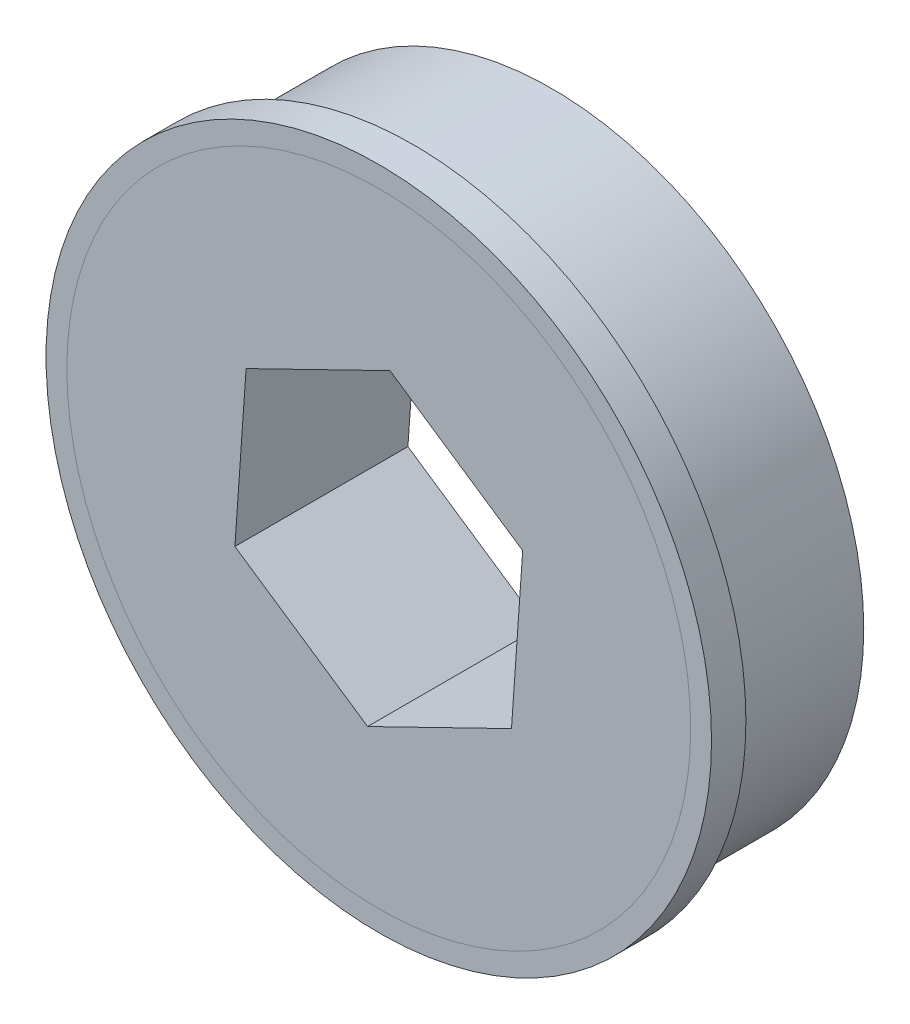
ISO-10303-21;
HEADER;
FILE_DESCRIPTION(('STEP AP214'),'2;1');
FILE_NAME('part.step','',(''),(''),'','','');
FILE_SCHEMA(('AUTOMOTIVE_DESIGN { 1 0 10303 214 1 1 1 1 }'));
ENDSEC;
DATA;
#1=APPLICATION_CONTEXT('core data for automotive mechanical design processes');
#2=APPLICATION_PROTOCOL_DEFINITION('international standard','automotive_design',2000,#1);
#3=PRODUCT_CONTEXT('',#1,'mechanical');
#4=PRODUCT('Part','Part','',(#3));
#5=PRODUCT_RELATED_PRODUCT_CATEGORY('part','',(#4));
#6=PRODUCT_DEFINITION_FORMATION('','',#4);
#7=PRODUCT_DEFINITION_CONTEXT('part definition',#1,'design');
#8=PRODUCT_DEFINITION('design','',#6,#7);
#9=PRODUCT_DEFINITION_SHAPE('','',#8);
#10=(LENGTH_UNIT() NAMED_UNIT(*) SI_UNIT(.MILLI.,.METRE.));
#11=(NAMED_UNIT(*) PLANE_ANGLE_UNIT() SI_UNIT($,.RADIAN.));
#12=(NAMED_UNIT(*) SI_UNIT($,.STERADIAN.) SOLID_ANGLE_UNIT());
#13=UNCERTAINTY_MEASURE_WITH_UNIT(LENGTH_MEASURE(1.E-05),#10,'distance_accuracy_value','');
#14=(GEOMETRIC_REPRESENTATION_CONTEXT(3) GLOBAL_UNCERTAINTY_ASSIGNED_CONTEXT((#13)) GLOBAL_UNIT_ASSIGNED_CONTEXT((#10,
#11,#12)) REPRESENTATION_CONTEXT('',''));
#15=CARTESIAN_POINT('',(0.,0.,0.));
#16=DIRECTION('',(0.,0.,1.));
#17=DIRECTION('',(1.,0.,0.));
#18=AXIS2_PLACEMENT_3D('',#15,#16,#17);
#19=CARTESIAN_POINT('',(0.,0.,6.35));
#20=DIRECTION('',(0.,0.,1.));
#21=DIRECTION('',(1.,0.,0.));
#22=AXIS2_PLACEMENT_3D('',#19,#20,#21);
#23=CYLINDRICAL_SURFACE('',#22,15.24);
#24=CARTESIAN_POINT('',(0.,0.,6.35));
#25=DIRECTION('',(0.,0.,1.));
#26=DIRECTION('',(1.,0.,0.));
#27=AXIS2_PLACEMENT_3D('',#24,#25,#26);
#28=CIRCLE('',#27,15.24);
#29=CARTESIAN_POINT('',(15.24,0.,6.35));
#30=VERTEX_POINT('',#29);
#31=EDGE_CURVE('E11',#30,#30,#28,.T.);
#32=ORIENTED_EDGE('',*,*,#31,.T.);
#33=EDGE_LOOP('',(#32));
#34=FACE_BOUND('',#33,.T.);
#35=CARTESIAN_POINT('',(0.,0.,7.9248));
#36=DIRECTION('',(0.,0.,1.));
#37=DIRECTION('',(1.,0.,0.));
#38=AXIS2_PLACEMENT_3D('',#35,#36,#37);
#39=CIRCLE('',#38,15.24);
#40=CARTESIAN_POINT('',(15.24,0.,7.9248));
#41=VERTEX_POINT('',#40);
#42=EDGE_CURVE('E44',#41,#41,#39,.T.);
#43=ORIENTED_EDGE('',*,*,#42,.F.);
#44=EDGE_LOOP('',(#43));
#45=FACE_BOUND('',#44,.T.);
#46=ADVANCED_FACE('F41',(#34,#45),#23,.T.);
#47=CARTESIAN_POINT('',(0.,0.,6.35));
#48=DIRECTION('',(0.,0.,1.));
#49=DIRECTION('',(1.,0.,0.));
#50=AXIS2_PLACEMENT_3D('',#47,#48,#49);
#51=PLANE('',#50);
#52=CARTESIAN_POINT('',(0.,0.,6.35));
#53=DIRECTION('',(0.,0.,1.));
#54=DIRECTION('',(1.,0.,0.));
#55=AXIS2_PLACEMENT_3D('',#52,#53,#54);
#56=CIRCLE('',#55,14.2875);
#57=CARTESIAN_POINT('',(14.2875,0.,6.35));
#58=VERTEX_POINT('',#57);
#59=EDGE_CURVE('E51',#58,#58,#56,.T.);
#60=ORIENTED_EDGE('',*,*,#59,.T.);
#61=EDGE_LOOP('',(#60));
#62=FACE_BOUND('',#61,.T.);
#63=ORIENTED_EDGE('',*,*,#31,.F.);
#64=EDGE_LOOP('',(#63));
#65=FACE_BOUND('',#64,.T.);
#66=ADVANCED_FACE('F59',(#62,#65),#51,.F.);
#67=CARTESIAN_POINT('',(0.,0.,7.9248));
#68=DIRECTION('',(0.,0.,1.));
#69=DIRECTION('',(1.,0.,0.));
#70=AXIS2_PLACEMENT_3D('',#67,#68,#69);
#71=PLANE('',#70);
#72=CARTESIAN_POINT('',(0.,0.,7.9248));
#73=DIRECTION('',(0.,0.,1.));
#74=DIRECTION('',(1.,0.,0.));
#75=AXIS2_PLACEMENT_3D('',#72,#73,#74);
#76=CIRCLE('',#75,14.2875);
#77=CARTESIAN_POINT('',(14.2875,0.,7.9248));
#78=VERTEX_POINT('',#77);
#79=EDGE_CURVE('E53',#78,#78,#76,.T.);
#80=ORIENTED_EDGE('',*,*,#79,.F.);
#81=EDGE_LOOP('',(#80));
#82=FACE_BOUND('',#81,.T.);
#83=ORIENTED_EDGE('',*,*,#42,.T.);
#84=EDGE_LOOP('',(#83));
#85=FACE_BOUND('',#84,.T.);
#86=ADVANCED_FACE('F65',(#82,#85),#71,.T.);
#87=CARTESIAN_POINT('',(0.,0.,6.35));
#88=DIRECTION('',(0.,0.,1.));
#89=DIRECTION('',(1.,0.,0.));
#90=AXIS2_PLACEMENT_3D('',#87,#88,#89);
#91=CYLINDRICAL_SURFACE('',#90,14.2875);
#92=ORIENTED_EDGE('',*,*,#59,.F.);
#93=EDGE_LOOP('',(#92));
#94=FACE_BOUND('',#93,.T.);
#95=ORIENTED_EDGE('',*,*,#79,.T.);
#96=EDGE_LOOP('',(#95));
#97=FACE_BOUND('',#96,.T.);
#98=ADVANCED_FACE('F62',(#94,#97),#91,.F.);
#99=CLOSED_SHELL('',(#46,#66,#86,#98));
#100=MANIFOLD_SOLID_BREP('B2',#99);
#101=CARTESIAN_POINT('',(0.,0.,7.9248));
#102=DIRECTION('',(0.,0.,-1.));
#103=DIRECTION('',(-1.,0.,0.));
#104=AXIS2_PLACEMENT_3D('',#101,#102,#103);
#105=CYLINDRICAL_SURFACE('',#104,14.2875);
#106=CARTESIAN_POINT('',(0.,0.,7.9248));
#107=DIRECTION('',(0.,0.,1.));
#108=DIRECTION('',(1.,0.,0.));
#109=AXIS2_PLACEMENT_3D('',#106,#107,#108);
#110=CIRCLE('',#109,14.2875);
#111=CARTESIAN_POINT('',(14.2875,0.,7.9248));
#112=VERTEX_POINT('',#111);
#113=EDGE_CURVE('E39',#112,#112,#110,.T.);
#114=ORIENTED_EDGE('',*,*,#113,.F.);
#115=EDGE_LOOP('',(#114));
#116=FACE_BOUND('',#115,.T.);
#117=CARTESIAN_POINT('',(0.,0.,0.));
#118=DIRECTION('',(0.,0.,1.));
#119=DIRECTION('',(1.,0.,0.));
#120=AXIS2_PLACEMENT_3D('',#117,#118,#119);
#121=CIRCLE('',#120,14.2875);
#122=CARTESIAN_POINT('',(14.2875,0.,0.));
#123=VERTEX_POINT('',#122);
#124=EDGE_CURVE('E106',#123,#123,#121,.T.);
#125=ORIENTED_EDGE('',*,*,#124,.T.);
#126=EDGE_LOOP('',(#125));
#127=FACE_BOUND('',#126,.T.);
#128=ADVANCED_FACE('F103',(#116,#127),#105,.T.);
#129=CARTESIAN_POINT('',(0.,0.,7.9248));
#130=DIRECTION('',(0.,0.,1.));
#131=DIRECTION('',(1.,0.,0.));
#132=AXIS2_PLACEMENT_3D('',#129,#130,#131);
#133=PLANE('',#132);
#134=DIRECTION('',(0.069947406769218,0.997550680560272,0.));
#135=VECTOR('',#134,1.);
#136=CARTESIAN_POINT('',(6.07800744284922,-4.10136061057826,7.9248));
#137=LINE('',#136,#135);
#138=CARTESIAN_POINT('',(6.07800744284922,-4.10136061057826,7.9248));
#139=VERTEX_POINT('',#138);
#140=CARTESIAN_POINT('',(6.59088620026623,3.21302854460919,7.9248));
#141=VERTEX_POINT('',#140);
#142=EDGE_CURVE('E117',#139,#141,#137,.T.);
#143=ORIENTED_EDGE('',*,*,#142,.F.);
#144=DIRECTION('',(0.89887793431226,0.438199109089149,0.));
#145=VECTOR('',#144,1.);
#146=CARTESIAN_POINT('',(-0.512878757417019,-7.31438915518744,7.9248));
#147=LINE('',#146,#145);
#148=CARTESIAN_POINT('',(-0.512878757417019,-7.31438915518744,7.9248));
#149=VERTEX_POINT('',#148);
#150=EDGE_CURVE('E174',#149,#139,#147,.T.);
#151=ORIENTED_EDGE('',*,*,#150,.F.);
#152=DIRECTION('',(0.828930527543042,-0.559351571471123,0.));
#153=VECTOR('',#152,1.);
#154=CARTESIAN_POINT('',(-6.59088620026623,-3.21302854460918,7.9248));
#155=LINE('',#154,#153);
#156=CARTESIAN_POINT('',(-6.59088620026623,-3.21302854460918,7.9248));
#157=VERTEX_POINT('',#156);
#158=EDGE_CURVE('E177',#157,#149,#155,.T.);
#159=ORIENTED_EDGE('',*,*,#158,.F.);
#160=DIRECTION('',(-0.0699474067692182,-0.997550680560272,0.));
#161=VECTOR('',#160,1.);
#162=CARTESIAN_POINT('',(-6.07800744284922,4.10136061057826,7.9248));
#163=LINE('',#162,#161);
#164=CARTESIAN_POINT('',(-6.07800744284922,4.10136061057826,7.9248));
#165=VERTEX_POINT('',#164);
#166=EDGE_CURVE('E193',#165,#157,#163,.T.);
#167=ORIENTED_EDGE('',*,*,#166,.F.);
#168=DIRECTION('',(-0.89887793431226,-0.438199109089149,0.));
#169=VECTOR('',#168,1.);
#170=CARTESIAN_POINT('',(0.512878757417019,7.31438915518744,7.9248));
#171=LINE('',#170,#169);
#172=CARTESIAN_POINT('',(0.512878757417019,7.31438915518744,7.9248));
#173=VERTEX_POINT('',#172);
#174=EDGE_CURVE('E190',#173,#165,#171,.T.);
#175=ORIENTED_EDGE('',*,*,#174,.F.);
#176=DIRECTION('',(-0.828930527543042,0.559351571471122,0.));
#177=VECTOR('',#176,1.);
#178=CARTESIAN_POINT('',(6.59088620026623,3.21302854460919,7.9248));
#179=LINE('',#178,#177);
#180=EDGE_CURVE('E188',#141,#173,#179,.T.);
#181=ORIENTED_EDGE('',*,*,#180,.F.);
#182=EDGE_LOOP('',(#143,#151,#159,#167,#175,#181));
#183=FACE_BOUND('',#182,.T.);
#184=ORIENTED_EDGE('',*,*,#113,.T.);
#185=EDGE_LOOP('',(#184));
#186=FACE_BOUND('',#185,.T.);
#187=ADVANCED_FACE('F210',(#183,#186),#133,.T.);
#188=CARTESIAN_POINT('',(0.,0.,0.));
#189=DIRECTION('',(0.,0.,1.));
#190=DIRECTION('',(1.,0.,0.));
#191=AXIS2_PLACEMENT_3D('',#188,#189,#190);
#192=PLANE('',#191);
#193=DIRECTION('',(0.89887793431226,0.438199109089149,0.));
#194=VECTOR('',#193,1.);
#195=CARTESIAN_POINT('',(-0.512878757417019,-7.31438915518744,0.));
#196=LINE('',#195,#194);
#197=CARTESIAN_POINT('',(-0.512878757417019,-7.31438915518744,0.));
#198=VERTEX_POINT('',#197);
#199=CARTESIAN_POINT('',(6.07800744284922,-4.10136061057826,0.));
#200=VERTEX_POINT('',#199);
#201=EDGE_CURVE('E163',#198,#200,#196,.T.);
#202=ORIENTED_EDGE('',*,*,#201,.T.);
#203=DIRECTION('',(0.069947406769218,0.997550680560272,0.));
#204=VECTOR('',#203,1.);
#205=CARTESIAN_POINT('',(6.07800744284922,-4.10136061057826,0.));
#206=LINE('',#205,#204);
#207=CARTESIAN_POINT('',(6.59088620026623,3.21302854460919,0.));
#208=VERTEX_POINT('',#207);
#209=EDGE_CURVE('E157',#200,#208,#206,.T.);
#210=ORIENTED_EDGE('',*,*,#209,.T.);
#211=DIRECTION('',(-0.828930527543042,0.559351571471122,0.));
#212=VECTOR('',#211,1.);
#213=CARTESIAN_POINT('',(6.59088620026623,3.21302854460919,0.));
#214=LINE('',#213,#212);
#215=CARTESIAN_POINT('',(0.512878757417019,7.31438915518745,0.));
#216=VERTEX_POINT('',#215);
#217=EDGE_CURVE('E166',#208,#216,#214,.T.);
#218=ORIENTED_EDGE('',*,*,#217,.T.);
#219=DIRECTION('',(-0.89887793431226,-0.438199109089149,0.));
#220=VECTOR('',#219,1.);
#221=CARTESIAN_POINT('',(0.512878757417019,7.31438915518744,0.));
#222=LINE('',#221,#220);
#223=CARTESIAN_POINT('',(-6.07800744284922,4.10136061057826,0.));
#224=VERTEX_POINT('',#223);
#225=EDGE_CURVE('E125',#216,#224,#222,.T.);
#226=ORIENTED_EDGE('',*,*,#225,.T.);
#227=DIRECTION('',(-0.0699474067692182,-0.997550680560272,0.));
#228=VECTOR('',#227,1.);
#229=CARTESIAN_POINT('',(-6.07800744284922,4.10136061057826,0.));
#230=LINE('',#229,#228);
#231=CARTESIAN_POINT('',(-6.59088620026623,-3.21302854460918,0.));
#232=VERTEX_POINT('',#231);
#233=EDGE_CURVE('E181',#224,#232,#230,.T.);
#234=ORIENTED_EDGE('',*,*,#233,.T.);
#235=DIRECTION('',(0.828930527543042,-0.559351571471123,0.));
#236=VECTOR('',#235,1.);
#237=CARTESIAN_POINT('',(-6.59088620026623,-3.21302854460918,0.));
#238=LINE('',#237,#236);
#239=EDGE_CURVE('E184',#232,#198,#238,.T.);
#240=ORIENTED_EDGE('',*,*,#239,.T.);
#241=EDGE_LOOP('',(#202,#210,#218,#226,#234,#240));
#242=FACE_BOUND('',#241,.T.);
#243=ORIENTED_EDGE('',*,*,#124,.F.);
#244=EDGE_LOOP('',(#243));
#245=FACE_BOUND('',#244,.T.);
#246=ADVANCED_FACE('F170',(#242,#245),#192,.F.);
#247=CARTESIAN_POINT('',(6.07800744284922,-4.10136061057826,0.));
#248=DIRECTION('',(0.997550680560272,-0.069947406769218,0.));
#249=DIRECTION('',(0.069947406769218,0.997550680560272,0.));
#250=AXIS2_PLACEMENT_3D('',#247,#248,#249);
#251=PLANE('',#250);
#252=ORIENTED_EDGE('',*,*,#142,.T.);
#253=DIRECTION('',(0.,0.,1.));
#254=VECTOR('',#253,1.);
#255=CARTESIAN_POINT('',(6.59088620026623,3.21302854460919,0.));
#256=LINE('',#255,#254);
#257=EDGE_CURVE('E153',#208,#141,#256,.T.);
#258=ORIENTED_EDGE('',*,*,#257,.F.);
#259=ORIENTED_EDGE('',*,*,#209,.F.);
#260=DIRECTION('',(0.,0.,1.));
#261=VECTOR('',#260,1.);
#262=CARTESIAN_POINT('',(6.07800744284922,-4.10136061057826,0.));
#263=LINE('',#262,#261);
#264=EDGE_CURVE('E198',#200,#139,#263,.T.);
#265=ORIENTED_EDGE('',*,*,#264,.T.);
#266=EDGE_LOOP('',(#252,#258,#259,#265));
#267=FACE_BOUND('',#266,.T.);
#268=ADVANCED_FACE('F155',(#267),#251,.F.);
#269=CARTESIAN_POINT('',(-0.512878757417019,-7.31438915518744,0.));
#270=DIRECTION('',(0.438199109089149,-0.89887793431226,0.));
#271=DIRECTION('',(0.89887793431226,0.438199109089149,0.));
#272=AXIS2_PLACEMENT_3D('',#269,#270,#271);
#273=PLANE('',#272);
#274=ORIENTED_EDGE('',*,*,#150,.T.);
#275=ORIENTED_EDGE('',*,*,#264,.F.);
#276=ORIENTED_EDGE('',*,*,#201,.F.);
#277=DIRECTION('',(0.,0.,1.));
#278=VECTOR('',#277,1.);
#279=CARTESIAN_POINT('',(-0.512878757417019,-7.31438915518744,0.));
#280=LINE('',#279,#278);
#281=EDGE_CURVE('E200',#198,#149,#280,.T.);
#282=ORIENTED_EDGE('',*,*,#281,.T.);
#283=EDGE_LOOP('',(#274,#275,#276,#282));
#284=FACE_BOUND('',#283,.T.);
#285=ADVANCED_FACE('F221',(#284),#273,.F.);
#286=CARTESIAN_POINT('',(-6.59088620026623,-3.21302854460918,0.));
#287=DIRECTION('',(-0.559351571471122,-0.828930527543042,0.));
#288=DIRECTION('',(0.828930527543042,-0.559351571471122,0.));
#289=AXIS2_PLACEMENT_3D('',#286,#287,#288);
#290=PLANE('',#289);
#291=ORIENTED_EDGE('',*,*,#158,.T.);
#292=ORIENTED_EDGE('',*,*,#281,.F.);
#293=ORIENTED_EDGE('',*,*,#239,.F.);
#294=DIRECTION('',(0.,0.,1.));
#295=VECTOR('',#294,1.);
#296=CARTESIAN_POINT('',(-6.59088620026623,-3.21302854460918,0.));
#297=LINE('',#296,#295);
#298=EDGE_CURVE('E202',#232,#157,#297,.T.);
#299=ORIENTED_EDGE('',*,*,#298,.T.);
#300=EDGE_LOOP('',(#291,#292,#293,#299));
#301=FACE_BOUND('',#300,.T.);
#302=ADVANCED_FACE('F219',(#301),#290,.F.);
#303=CARTESIAN_POINT('',(-6.07800744284922,4.10136061057826,0.));
#304=DIRECTION('',(-0.997550680560272,0.0699474067692182,0.));
#305=DIRECTION('',(-0.0699474067692182,-0.997550680560272,0.));
#306=AXIS2_PLACEMENT_3D('',#303,#304,#305);
#307=PLANE('',#306);
#308=ORIENTED_EDGE('',*,*,#166,.T.);
#309=ORIENTED_EDGE('',*,*,#298,.F.);
#310=ORIENTED_EDGE('',*,*,#233,.F.);
#311=DIRECTION('',(0.,0.,1.));
#312=VECTOR('',#311,1.);
#313=CARTESIAN_POINT('',(-6.07800744284922,4.10136061057826,0.));
#314=LINE('',#313,#312);
#315=EDGE_CURVE('E204',#224,#165,#314,.T.);
#316=ORIENTED_EDGE('',*,*,#315,.T.);
#317=EDGE_LOOP('',(#308,#309,#310,#316));
#318=FACE_BOUND('',#317,.T.);
#319=ADVANCED_FACE('F215',(#318),#307,.F.);
#320=CARTESIAN_POINT('',(0.512878757417019,7.31438915518744,0.));
#321=DIRECTION('',(-0.438199109089149,0.89887793431226,0.));
#322=DIRECTION('',(-0.89887793431226,-0.438199109089149,0.));
#323=AXIS2_PLACEMENT_3D('',#320,#321,#322);
#324=PLANE('',#323);
#325=ORIENTED_EDGE('',*,*,#174,.T.);
#326=ORIENTED_EDGE('',*,*,#315,.F.);
#327=ORIENTED_EDGE('',*,*,#225,.F.);
#328=DIRECTION('',(0.,0.,1.));
#329=VECTOR('',#328,1.);
#330=CARTESIAN_POINT('',(0.512878757417019,7.31438915518744,0.));
#331=LINE('',#330,#329);
#332=EDGE_CURVE('E162',#216,#173,#331,.T.);
#333=ORIENTED_EDGE('',*,*,#332,.T.);
#334=EDGE_LOOP('',(#325,#326,#327,#333));
#335=FACE_BOUND('',#334,.T.);
#336=ADVANCED_FACE('F206',(#335),#324,.F.);
#337=CARTESIAN_POINT('',(6.59088620026623,3.21302854460919,0.));
#338=DIRECTION('',(0.559351571471123,0.828930527543042,0.));
#339=DIRECTION('',(-0.828930527543042,0.559351571471123,0.));
#340=AXIS2_PLACEMENT_3D('',#337,#338,#339);
#341=PLANE('',#340);
#342=ORIENTED_EDGE('',*,*,#180,.T.);
#343=ORIENTED_EDGE('',*,*,#332,.F.);
#344=ORIENTED_EDGE('',*,*,#217,.F.);
#345=ORIENTED_EDGE('',*,*,#257,.T.);
#346=EDGE_LOOP('',(#342,#343,#344,#345));
#347=FACE_BOUND('',#346,.T.);
#348=ADVANCED_FACE('F167',(#347),#341,.F.);
#349=CLOSED_SHELL('',(#128,#187,#246,#268,#285,#302,#319,#336,#348));
#350=MANIFOLD_SOLID_BREP('B6',#349);
#351=ADVANCED_BREP_SHAPE_REPRESENTATION('',(#18,#100,#350),#14);
#352=SHAPE_DEFINITION_REPRESENTATION(#9,#351);
ENDSEC;
END-ISO-10303-21;
